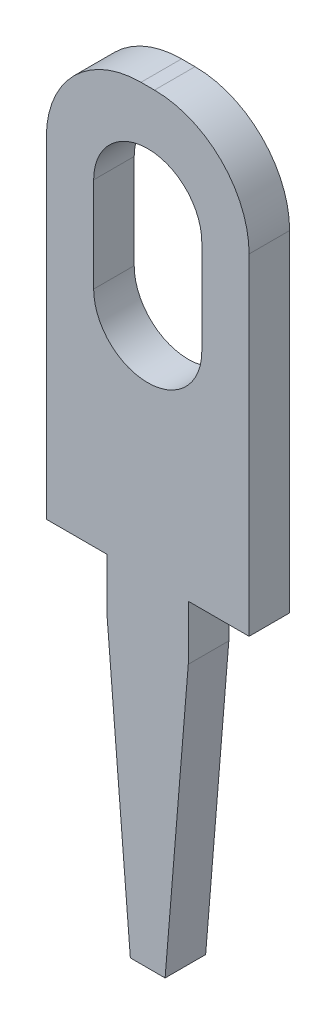
ISO-10303-21;
HEADER;
FILE_DESCRIPTION(('STEP AP214'),'2;1');
FILE_NAME('part.step','',(''),(''),'','','');
FILE_SCHEMA(('AUTOMOTIVE_DESIGN { 1 0 10303 214 1 1 1 1 }'));
ENDSEC;
DATA;
#1=APPLICATION_CONTEXT('core data for automotive mechanical design processes');
#2=APPLICATION_PROTOCOL_DEFINITION('international standard','automotive_design',2000,#1);
#3=PRODUCT_CONTEXT('',#1,'mechanical');
#4=PRODUCT('Part','Part','',(#3));
#5=PRODUCT_RELATED_PRODUCT_CATEGORY('part','',(#4));
#6=PRODUCT_DEFINITION_FORMATION('','',#4);
#7=PRODUCT_DEFINITION_CONTEXT('part definition',#1,'design');
#8=PRODUCT_DEFINITION('design','',#6,#7);
#9=PRODUCT_DEFINITION_SHAPE('','',#8);
#10=(LENGTH_UNIT() NAMED_UNIT(*) SI_UNIT(.MILLI.,.METRE.));
#11=(NAMED_UNIT(*) PLANE_ANGLE_UNIT() SI_UNIT($,.RADIAN.));
#12=(NAMED_UNIT(*) SI_UNIT($,.STERADIAN.) SOLID_ANGLE_UNIT());
#13=UNCERTAINTY_MEASURE_WITH_UNIT(LENGTH_MEASURE(1.E-05),#10,'distance_accuracy_value','');
#14=(GEOMETRIC_REPRESENTATION_CONTEXT(3) GLOBAL_UNCERTAINTY_ASSIGNED_CONTEXT((#13)) GLOBAL_UNIT_ASSIGNED_CONTEXT((#10,
#11,#12)) REPRESENTATION_CONTEXT('',''));
#15=CARTESIAN_POINT('',(0.,0.,0.));
#16=DIRECTION('',(0.,0.,1.));
#17=DIRECTION('',(1.,0.,0.));
#18=AXIS2_PLACEMENT_3D('',#15,#16,#17);
#19=CARTESIAN_POINT('',(-0.0999999999999998,4.9,0.6));
#20=DIRECTION('',(0.,0.,-1.));
#21=DIRECTION('',(-1.,0.,0.));
#22=AXIS2_PLACEMENT_3D('',#19,#20,#21);
#23=PLANE('',#22);
#24=DIRECTION('',(0.,-1.,0.));
#25=VECTOR('',#24,1.);
#26=CARTESIAN_POINT('',(-1.5,0.,0.6));
#27=LINE('',#26,#25);
#28=CARTESIAN_POINT('',(-1.5,4.89999999999999,0.6));
#29=VERTEX_POINT('',#28);
#30=CARTESIAN_POINT('',(-1.5,0.,0.6));
#31=VERTEX_POINT('',#30);
#32=EDGE_CURVE('E180',#29,#31,#27,.T.);
#33=ORIENTED_EDGE('',*,*,#32,.T.);
#34=DIRECTION('',(1.,0.,0.));
#35=VECTOR('',#34,1.);
#36=CARTESIAN_POINT('',(-1.5,0.,0.6));
#37=LINE('',#36,#35);
#38=CARTESIAN_POINT('',(-0.6,0.,0.6));
#39=VERTEX_POINT('',#38);
#40=EDGE_CURVE('E183',#31,#39,#37,.T.);
#41=ORIENTED_EDGE('',*,*,#40,.T.);
#42=DIRECTION('',(0.,-1.,0.));
#43=VECTOR('',#42,1.);
#44=CARTESIAN_POINT('',(-0.6,0.,0.6));
#45=LINE('',#44,#43);
#46=CARTESIAN_POINT('',(-0.6,-0.808174013006271,0.6));
#47=VERTEX_POINT('',#46);
#48=EDGE_CURVE('E186',#39,#47,#45,.T.);
#49=ORIENTED_EDGE('',*,*,#48,.T.);
#50=DIRECTION('',(0.0815209190456559,-0.996671630858404,0.));
#51=VECTOR('',#50,1.);
#52=CARTESIAN_POINT('',(-0.257137319495211,-5.,0.6));
#53=LINE('',#52,#51);
#54=CARTESIAN_POINT('',(-0.257137319495211,-5.,0.6));
#55=VERTEX_POINT('',#54);
#56=EDGE_CURVE('E188',#47,#55,#53,.T.);
#57=ORIENTED_EDGE('',*,*,#56,.T.);
#58=DIRECTION('',(1.,0.,0.));
#59=VECTOR('',#58,1.);
#60=CARTESIAN_POINT('',(-0.257137319495211,-5.,0.6));
#61=LINE('',#60,#59);
#62=CARTESIAN_POINT('',(0.257137319495211,-5.,0.6));
#63=VERTEX_POINT('',#62);
#64=EDGE_CURVE('E190',#55,#63,#61,.T.);
#65=ORIENTED_EDGE('',*,*,#64,.T.);
#66=DIRECTION('',(0.0815209190456559,0.996671630858404,0.));
#67=VECTOR('',#66,1.);
#68=CARTESIAN_POINT('',(0.257137319495211,-5.,0.6));
#69=LINE('',#68,#67);
#70=CARTESIAN_POINT('',(0.6,-0.808174013006271,0.6));
#71=VERTEX_POINT('',#70);
#72=EDGE_CURVE('E192',#63,#71,#69,.T.);
#73=ORIENTED_EDGE('',*,*,#72,.T.);
#74=DIRECTION('',(0.,1.,0.));
#75=VECTOR('',#74,1.);
#76=CARTESIAN_POINT('',(0.6,0.,0.6));
#77=LINE('',#76,#75);
#78=CARTESIAN_POINT('',(0.6,0.,0.6));
#79=VERTEX_POINT('',#78);
#80=EDGE_CURVE('E194',#71,#79,#77,.T.);
#81=ORIENTED_EDGE('',*,*,#80,.T.);
#82=DIRECTION('',(1.,0.,0.));
#83=VECTOR('',#82,1.);
#84=CARTESIAN_POINT('',(0.6,0.,0.6));
#85=LINE('',#84,#83);
#86=CARTESIAN_POINT('',(1.5,0.,0.6));
#87=VERTEX_POINT('',#86);
#88=EDGE_CURVE('E196',#79,#87,#85,.T.);
#89=ORIENTED_EDGE('',*,*,#88,.T.);
#90=DIRECTION('',(0.,1.,0.));
#91=VECTOR('',#90,1.);
#92=CARTESIAN_POINT('',(1.5,0.,0.6));
#93=LINE('',#92,#91);
#94=CARTESIAN_POINT('',(1.5,4.89999999999999,0.6));
#95=VERTEX_POINT('',#94);
#96=EDGE_CURVE('E198',#87,#95,#93,.T.);
#97=ORIENTED_EDGE('',*,*,#96,.T.);
#98=CARTESIAN_POINT('',(0.0999999999999998,4.9,0.6));
#99=DIRECTION('',(0.,0.,1.));
#100=DIRECTION('',(-1.,0.,0.));
#101=AXIS2_PLACEMENT_3D('',#98,#99,#100);
#102=CIRCLE('',#101,1.4);
#103=CARTESIAN_POINT('',(0.0999999999999904,6.3,0.6));
#104=VERTEX_POINT('',#103);
#105=EDGE_CURVE('E200',#95,#104,#102,.T.);
#106=ORIENTED_EDGE('',*,*,#105,.T.);
#107=DIRECTION('',(-1.,0.,0.));
#108=VECTOR('',#107,1.);
#109=CARTESIAN_POINT('',(-0.0999999999999903,6.3,0.6));
#110=LINE('',#109,#108);
#111=CARTESIAN_POINT('',(-0.0999999999999903,6.3,0.6));
#112=VERTEX_POINT('',#111);
#113=EDGE_CURVE('E202',#104,#112,#110,.T.);
#114=ORIENTED_EDGE('',*,*,#113,.T.);
#115=CARTESIAN_POINT('',(-0.0999999999999998,4.9,0.6));
#116=DIRECTION('',(0.,0.,1.));
#117=DIRECTION('',(-1.,0.,0.));
#118=AXIS2_PLACEMENT_3D('',#115,#116,#117);
#119=CIRCLE('',#118,1.4);
#120=EDGE_CURVE('E204',#112,#29,#119,.T.);
#121=ORIENTED_EDGE('',*,*,#120,.T.);
#122=EDGE_LOOP('',(#33,#41,#49,#57,#65,#73,#81,#89,#97,#106,#114,#121));
#123=FACE_BOUND('',#122,.T.);
#124=CARTESIAN_POINT('',(0.,4.7,0.6));
#125=DIRECTION('',(0.,0.,1.));
#126=DIRECTION('',(1.,0.,0.));
#127=AXIS2_PLACEMENT_3D('',#124,#125,#126);
#128=CIRCLE('',#127,0.8);
#129=CARTESIAN_POINT('',(0.8,4.7,0.6));
#130=VERTEX_POINT('',#129);
#131=CARTESIAN_POINT('',(-0.8,4.7,0.6));
#132=VERTEX_POINT('',#131);
#133=EDGE_CURVE('E144',#130,#132,#128,.T.);
#134=ORIENTED_EDGE('',*,*,#133,.F.);
#135=DIRECTION('',(0.,1.,0.));
#136=VECTOR('',#135,1.);
#137=CARTESIAN_POINT('',(0.8,4.7,0.6));
#138=LINE('',#137,#136);
#139=CARTESIAN_POINT('',(0.8,3.3,0.6));
#140=VERTEX_POINT('',#139);
#141=EDGE_CURVE('E166',#140,#130,#138,.T.);
#142=ORIENTED_EDGE('',*,*,#141,.F.);
#143=CARTESIAN_POINT('',(0.,3.3,0.6));
#144=DIRECTION('',(0.,0.,1.));
#145=DIRECTION('',(1.,0.,0.));
#146=AXIS2_PLACEMENT_3D('',#143,#144,#145);
#147=CIRCLE('',#146,0.8);
#148=CARTESIAN_POINT('',(-0.8,3.3,0.6));
#149=VERTEX_POINT('',#148);
#150=EDGE_CURVE('E164',#149,#140,#147,.T.);
#151=ORIENTED_EDGE('',*,*,#150,.F.);
#152=DIRECTION('',(0.,-1.,0.));
#153=VECTOR('',#152,1.);
#154=CARTESIAN_POINT('',(-0.8,4.7,0.6));
#155=LINE('',#154,#153);
#156=EDGE_CURVE('E152',#132,#149,#155,.T.);
#157=ORIENTED_EDGE('',*,*,#156,.F.);
#158=EDGE_LOOP('',(#134,#142,#151,#157));
#159=FACE_BOUND('',#158,.T.);
#160=ADVANCED_FACE('F31',(#123,#159),#23,.F.);
#161=CARTESIAN_POINT('',(-0.0999999999999998,4.9,0.));
#162=DIRECTION('',(0.,0.,-1.));
#163=DIRECTION('',(-1.,0.,0.));
#164=AXIS2_PLACEMENT_3D('',#161,#162,#163);
#165=PLANE('',#164);
#166=DIRECTION('',(0.,-1.,0.));
#167=VECTOR('',#166,1.);
#168=CARTESIAN_POINT('',(-1.5,0.,0.));
#169=LINE('',#168,#167);
#170=CARTESIAN_POINT('',(-1.5,4.89999999999999,0.));
#171=VERTEX_POINT('',#170);
#172=CARTESIAN_POINT('',(-1.5,0.,0.));
#173=VERTEX_POINT('',#172);
#174=EDGE_CURVE('E160',#171,#173,#169,.T.);
#175=ORIENTED_EDGE('',*,*,#174,.F.);
#176=CARTESIAN_POINT('',(-0.0999999999999998,4.9,0.));
#177=DIRECTION('',(0.,0.,1.));
#178=DIRECTION('',(-1.,0.,0.));
#179=AXIS2_PLACEMENT_3D('',#176,#177,#178);
#180=CIRCLE('',#179,1.4);
#181=CARTESIAN_POINT('',(-0.0999999999999903,6.3,0.));
#182=VERTEX_POINT('',#181);
#183=EDGE_CURVE('E184',#182,#171,#180,.T.);
#184=ORIENTED_EDGE('',*,*,#183,.F.);
#185=DIRECTION('',(-1.,0.,0.));
#186=VECTOR('',#185,1.);
#187=CARTESIAN_POINT('',(-0.0999999999999903,6.3,0.));
#188=LINE('',#187,#186);
#189=CARTESIAN_POINT('',(0.0999999999999904,6.3,0.));
#190=VERTEX_POINT('',#189);
#191=EDGE_CURVE('E227',#190,#182,#188,.T.);
#192=ORIENTED_EDGE('',*,*,#191,.F.);
#193=CARTESIAN_POINT('',(0.0999999999999998,4.9,0.));
#194=DIRECTION('',(0.,0.,1.));
#195=DIRECTION('',(-1.,0.,0.));
#196=AXIS2_PLACEMENT_3D('',#193,#194,#195);
#197=CIRCLE('',#196,1.4);
#198=CARTESIAN_POINT('',(1.5,4.89999999999999,0.));
#199=VERTEX_POINT('',#198);
#200=EDGE_CURVE('E225',#199,#190,#197,.T.);
#201=ORIENTED_EDGE('',*,*,#200,.F.);
#202=DIRECTION('',(0.,1.,0.));
#203=VECTOR('',#202,1.);
#204=CARTESIAN_POINT('',(1.5,0.,0.));
#205=LINE('',#204,#203);
#206=CARTESIAN_POINT('',(1.5,0.,0.));
#207=VERTEX_POINT('',#206);
#208=EDGE_CURVE('E223',#207,#199,#205,.T.);
#209=ORIENTED_EDGE('',*,*,#208,.F.);
#210=DIRECTION('',(1.,0.,0.));
#211=VECTOR('',#210,1.);
#212=CARTESIAN_POINT('',(0.6,0.,0.));
#213=LINE('',#212,#211);
#214=CARTESIAN_POINT('',(0.6,0.,0.));
#215=VERTEX_POINT('',#214);
#216=EDGE_CURVE('E221',#215,#207,#213,.T.);
#217=ORIENTED_EDGE('',*,*,#216,.F.);
#218=DIRECTION('',(0.,1.,0.));
#219=VECTOR('',#218,1.);
#220=CARTESIAN_POINT('',(0.6,0.,0.));
#221=LINE('',#220,#219);
#222=CARTESIAN_POINT('',(0.6,-0.808174013006271,0.));
#223=VERTEX_POINT('',#222);
#224=EDGE_CURVE('E219',#223,#215,#221,.T.);
#225=ORIENTED_EDGE('',*,*,#224,.F.);
#226=DIRECTION('',(0.0815209190456559,0.996671630858404,0.));
#227=VECTOR('',#226,1.);
#228=CARTESIAN_POINT('',(0.257137319495211,-5.,0.));
#229=LINE('',#228,#227);
#230=CARTESIAN_POINT('',(0.257137319495211,-5.,0.));
#231=VERTEX_POINT('',#230);
#232=EDGE_CURVE('E217',#231,#223,#229,.T.);
#233=ORIENTED_EDGE('',*,*,#232,.F.);
#234=DIRECTION('',(1.,0.,0.));
#235=VECTOR('',#234,1.);
#236=CARTESIAN_POINT('',(-0.257137319495211,-5.,0.));
#237=LINE('',#236,#235);
#238=CARTESIAN_POINT('',(-0.257137319495211,-5.,0.));
#239=VERTEX_POINT('',#238);
#240=EDGE_CURVE('E215',#239,#231,#237,.T.);
#241=ORIENTED_EDGE('',*,*,#240,.F.);
#242=DIRECTION('',(0.0815209190456559,-0.996671630858404,0.));
#243=VECTOR('',#242,1.);
#244=CARTESIAN_POINT('',(-0.257137319495211,-5.,0.));
#245=LINE('',#244,#243);
#246=CARTESIAN_POINT('',(-0.6,-0.808174013006271,0.));
#247=VERTEX_POINT('',#246);
#248=EDGE_CURVE('E213',#247,#239,#245,.T.);
#249=ORIENTED_EDGE('',*,*,#248,.F.);
#250=DIRECTION('',(0.,-1.,0.));
#251=VECTOR('',#250,1.);
#252=CARTESIAN_POINT('',(-0.6,0.,0.));
#253=LINE('',#252,#251);
#254=CARTESIAN_POINT('',(-0.6,0.,0.));
#255=VERTEX_POINT('',#254);
#256=EDGE_CURVE('E211',#255,#247,#253,.T.);
#257=ORIENTED_EDGE('',*,*,#256,.F.);
#258=DIRECTION('',(1.,0.,0.));
#259=VECTOR('',#258,1.);
#260=CARTESIAN_POINT('',(-1.5,0.,0.));
#261=LINE('',#260,#259);
#262=EDGE_CURVE('E209',#173,#255,#261,.T.);
#263=ORIENTED_EDGE('',*,*,#262,.F.);
#264=EDGE_LOOP('',(#175,#184,#192,#201,#209,#217,#225,#233,#241,#249,#257,#263));
#265=FACE_BOUND('',#264,.T.);
#266=DIRECTION('',(0.,1.,0.));
#267=VECTOR('',#266,1.);
#268=CARTESIAN_POINT('',(0.8,4.7,0.));
#269=LINE('',#268,#267);
#270=CARTESIAN_POINT('',(0.8,3.3,0.));
#271=VERTEX_POINT('',#270);
#272=CARTESIAN_POINT('',(0.8,4.7,0.));
#273=VERTEX_POINT('',#272);
#274=EDGE_CURVE('E153',#271,#273,#269,.T.);
#275=ORIENTED_EDGE('',*,*,#274,.T.);
#276=CARTESIAN_POINT('',(0.,4.7,0.));
#277=DIRECTION('',(0.,0.,1.));
#278=DIRECTION('',(1.,0.,0.));
#279=AXIS2_PLACEMENT_3D('',#276,#277,#278);
#280=CIRCLE('',#279,0.8);
#281=CARTESIAN_POINT('',(-0.8,4.7,0.));
#282=VERTEX_POINT('',#281);
#283=EDGE_CURVE('E54',#273,#282,#280,.T.);
#284=ORIENTED_EDGE('',*,*,#283,.T.);
#285=DIRECTION('',(0.,-1.,0.));
#286=VECTOR('',#285,1.);
#287=CARTESIAN_POINT('',(-0.8,4.7,0.));
#288=LINE('',#287,#286);
#289=CARTESIAN_POINT('',(-0.8,3.3,0.));
#290=VERTEX_POINT('',#289);
#291=EDGE_CURVE('E159',#282,#290,#288,.T.);
#292=ORIENTED_EDGE('',*,*,#291,.T.);
#293=CARTESIAN_POINT('',(0.,3.3,0.));
#294=DIRECTION('',(0.,0.,1.));
#295=DIRECTION('',(1.,0.,0.));
#296=AXIS2_PLACEMENT_3D('',#293,#294,#295);
#297=CIRCLE('',#296,0.8);
#298=EDGE_CURVE('E172',#290,#271,#297,.T.);
#299=ORIENTED_EDGE('',*,*,#298,.T.);
#300=EDGE_LOOP('',(#275,#284,#292,#299));
#301=FACE_BOUND('',#300,.T.);
#302=ADVANCED_FACE('F269',(#265,#301),#165,.T.);
#303=CARTESIAN_POINT('',(-1.5,0.,0.6));
#304=DIRECTION('',(1.,0.,0.));
#305=DIRECTION('',(0.,0.,-1.));
#306=AXIS2_PLACEMENT_3D('',#303,#304,#305);
#307=PLANE('',#306);
#308=ORIENTED_EDGE('',*,*,#174,.T.);
#309=DIRECTION('',(0.,0.,-1.));
#310=VECTOR('',#309,1.);
#311=CARTESIAN_POINT('',(-1.5,0.,0.6));
#312=LINE('',#311,#310);
#313=EDGE_CURVE('E11',#31,#173,#312,.T.);
#314=ORIENTED_EDGE('',*,*,#313,.F.);
#315=ORIENTED_EDGE('',*,*,#32,.F.);
#316=DIRECTION('',(0.,0.,-1.));
#317=VECTOR('',#316,1.);
#318=CARTESIAN_POINT('',(-1.5,4.89999999999999,0.6));
#319=LINE('',#318,#317);
#320=EDGE_CURVE('E206',#29,#171,#319,.T.);
#321=ORIENTED_EDGE('',*,*,#320,.T.);
#322=EDGE_LOOP('',(#308,#314,#315,#321));
#323=FACE_BOUND('',#322,.T.);
#324=ADVANCED_FACE('F33',(#323),#307,.F.);
#325=CARTESIAN_POINT('',(-1.5,0.,0.6));
#326=DIRECTION('',(0.,1.,0.));
#327=DIRECTION('',(-1.,0.,0.));
#328=AXIS2_PLACEMENT_3D('',#325,#326,#327);
#329=PLANE('',#328);
#330=ORIENTED_EDGE('',*,*,#262,.T.);
#331=DIRECTION('',(0.,0.,-1.));
#332=VECTOR('',#331,1.);
#333=CARTESIAN_POINT('',(-0.6,0.,0.6));
#334=LINE('',#333,#332);
#335=EDGE_CURVE('E39',#39,#255,#334,.T.);
#336=ORIENTED_EDGE('',*,*,#335,.F.);
#337=ORIENTED_EDGE('',*,*,#40,.F.);
#338=ORIENTED_EDGE('',*,*,#313,.T.);
#339=EDGE_LOOP('',(#330,#336,#337,#338));
#340=FACE_BOUND('',#339,.T.);
#341=ADVANCED_FACE('F286',(#340),#329,.F.);
#342=CARTESIAN_POINT('',(-0.6,0.,0.6));
#343=DIRECTION('',(1.,0.,0.));
#344=DIRECTION('',(0.,1.,0.));
#345=AXIS2_PLACEMENT_3D('',#342,#343,#344);
#346=PLANE('',#345);
#347=ORIENTED_EDGE('',*,*,#256,.T.);
#348=DIRECTION('',(0.,0.,-1.));
#349=VECTOR('',#348,1.);
#350=CARTESIAN_POINT('',(-0.6,-0.808174013006271,0.6));
#351=LINE('',#350,#349);
#352=EDGE_CURVE('E256',#47,#247,#351,.T.);
#353=ORIENTED_EDGE('',*,*,#352,.F.);
#354=ORIENTED_EDGE('',*,*,#48,.F.);
#355=ORIENTED_EDGE('',*,*,#335,.T.);
#356=EDGE_LOOP('',(#347,#353,#354,#355));
#357=FACE_BOUND('',#356,.T.);
#358=ADVANCED_FACE('F263',(#357),#346,.F.);
#359=CARTESIAN_POINT('',(-0.257137319495211,-5.,0.6));
#360=DIRECTION('',(0.996671630858404,0.0815209190456558,0.));
#361=DIRECTION('',(-0.0815209190456559,0.996671630858405,0.));
#362=AXIS2_PLACEMENT_3D('',#359,#360,#361);
#363=PLANE('',#362);
#364=ORIENTED_EDGE('',*,*,#248,.T.);
#365=DIRECTION('',(0.,0.,-1.));
#366=VECTOR('',#365,1.);
#367=CARTESIAN_POINT('',(-0.257137319495211,-5.,0.6));
#368=LINE('',#367,#366);
#369=EDGE_CURVE('E253',#55,#239,#368,.T.);
#370=ORIENTED_EDGE('',*,*,#369,.F.);
#371=ORIENTED_EDGE('',*,*,#56,.F.);
#372=ORIENTED_EDGE('',*,*,#352,.T.);
#373=EDGE_LOOP('',(#364,#370,#371,#372));
#374=FACE_BOUND('',#373,.T.);
#375=ADVANCED_FACE('F275',(#374),#363,.F.);
#376=CARTESIAN_POINT('',(-0.257137319495211,-5.,0.6));
#377=DIRECTION('',(0.,1.,0.));
#378=DIRECTION('',(0.,0.,1.));
#379=AXIS2_PLACEMENT_3D('',#376,#377,#378);
#380=PLANE('',#379);
#381=ORIENTED_EDGE('',*,*,#240,.T.);
#382=DIRECTION('',(0.,0.,-1.));
#383=VECTOR('',#382,1.);
#384=CARTESIAN_POINT('',(0.257137319495211,-5.,0.6));
#385=LINE('',#384,#383);
#386=EDGE_CURVE('E250',#63,#231,#385,.T.);
#387=ORIENTED_EDGE('',*,*,#386,.F.);
#388=ORIENTED_EDGE('',*,*,#64,.F.);
#389=ORIENTED_EDGE('',*,*,#369,.T.);
#390=EDGE_LOOP('',(#381,#387,#388,#389));
#391=FACE_BOUND('',#390,.T.);
#392=ADVANCED_FACE('F279',(#391),#380,.F.);
#393=CARTESIAN_POINT('',(0.257137319495211,-5.,0.6));
#394=DIRECTION('',(-0.996671630858404,0.0815209190456558,0.));
#395=DIRECTION('',(-0.0815209190456559,-0.996671630858405,0.));
#396=AXIS2_PLACEMENT_3D('',#393,#394,#395);
#397=PLANE('',#396);
#398=ORIENTED_EDGE('',*,*,#232,.T.);
#399=DIRECTION('',(0.,0.,-1.));
#400=VECTOR('',#399,1.);
#401=CARTESIAN_POINT('',(0.6,-0.808174013006271,0.6));
#402=LINE('',#401,#400);
#403=EDGE_CURVE('E247',#71,#223,#402,.T.);
#404=ORIENTED_EDGE('',*,*,#403,.F.);
#405=ORIENTED_EDGE('',*,*,#72,.F.);
#406=ORIENTED_EDGE('',*,*,#386,.T.);
#407=EDGE_LOOP('',(#398,#404,#405,#406));
#408=FACE_BOUND('',#407,.T.);
#409=ADVANCED_FACE('F319',(#408),#397,.F.);
#410=CARTESIAN_POINT('',(0.6,0.,0.6));
#411=DIRECTION('',(-1.,0.,0.));
#412=DIRECTION('',(0.,-1.,0.));
#413=AXIS2_PLACEMENT_3D('',#410,#411,#412);
#414=PLANE('',#413);
#415=ORIENTED_EDGE('',*,*,#224,.T.);
#416=DIRECTION('',(0.,0.,-1.));
#417=VECTOR('',#416,1.);
#418=CARTESIAN_POINT('',(0.6,0.,0.6));
#419=LINE('',#418,#417);
#420=EDGE_CURVE('E244',#79,#215,#419,.T.);
#421=ORIENTED_EDGE('',*,*,#420,.F.);
#422=ORIENTED_EDGE('',*,*,#80,.F.);
#423=ORIENTED_EDGE('',*,*,#403,.T.);
#424=EDGE_LOOP('',(#415,#421,#422,#423));
#425=FACE_BOUND('',#424,.T.);
#426=ADVANCED_FACE('F317',(#425),#414,.F.);
#427=CARTESIAN_POINT('',(0.6,0.,0.6));
#428=DIRECTION('',(0.,1.,0.));
#429=DIRECTION('',(-1.,0.,0.));
#430=AXIS2_PLACEMENT_3D('',#427,#428,#429);
#431=PLANE('',#430);
#432=ORIENTED_EDGE('',*,*,#216,.T.);
#433=DIRECTION('',(0.,0.,-1.));
#434=VECTOR('',#433,1.);
#435=CARTESIAN_POINT('',(1.5,0.,0.6));
#436=LINE('',#435,#434);
#437=EDGE_CURVE('E241',#87,#207,#436,.T.);
#438=ORIENTED_EDGE('',*,*,#437,.F.);
#439=ORIENTED_EDGE('',*,*,#88,.F.);
#440=ORIENTED_EDGE('',*,*,#420,.T.);
#441=EDGE_LOOP('',(#432,#438,#439,#440));
#442=FACE_BOUND('',#441,.T.);
#443=ADVANCED_FACE('F313',(#442),#431,.F.);
#444=CARTESIAN_POINT('',(1.5,0.,0.6));
#445=DIRECTION('',(-1.,0.,0.));
#446=DIRECTION('',(0.,0.,1.));
#447=AXIS2_PLACEMENT_3D('',#444,#445,#446);
#448=PLANE('',#447);
#449=ORIENTED_EDGE('',*,*,#208,.T.);
#450=DIRECTION('',(0.,0.,-1.));
#451=VECTOR('',#450,1.);
#452=CARTESIAN_POINT('',(1.5,4.89999999999999,0.6));
#453=LINE('',#452,#451);
#454=EDGE_CURVE('E238',#95,#199,#453,.T.);
#455=ORIENTED_EDGE('',*,*,#454,.F.);
#456=ORIENTED_EDGE('',*,*,#96,.F.);
#457=ORIENTED_EDGE('',*,*,#437,.T.);
#458=EDGE_LOOP('',(#449,#455,#456,#457));
#459=FACE_BOUND('',#458,.T.);
#460=ADVANCED_FACE('F308',(#459),#448,.F.);
#461=CARTESIAN_POINT('',(0.0999999999999998,4.9,0.6));
#462=DIRECTION('',(0.,0.,-1.));
#463=DIRECTION('',(-1.,0.,0.));
#464=AXIS2_PLACEMENT_3D('',#461,#462,#463);
#465=CYLINDRICAL_SURFACE('',#464,1.4);
#466=ORIENTED_EDGE('',*,*,#200,.T.);
#467=DIRECTION('',(0.,0.,-1.));
#468=VECTOR('',#467,1.);
#469=CARTESIAN_POINT('',(0.0999999999999904,6.3,0.6));
#470=LINE('',#469,#468);
#471=EDGE_CURVE('E235',#104,#190,#470,.T.);
#472=ORIENTED_EDGE('',*,*,#471,.F.);
#473=ORIENTED_EDGE('',*,*,#105,.F.);
#474=ORIENTED_EDGE('',*,*,#454,.T.);
#475=EDGE_LOOP('',(#466,#472,#473,#474));
#476=FACE_BOUND('',#475,.T.);
#477=ADVANCED_FACE('F302',(#476),#465,.T.);
#478=CARTESIAN_POINT('',(-0.0999999999999903,6.3,0.6));
#479=DIRECTION('',(0.,-1.,0.));
#480=DIRECTION('',(0.,0.,-1.));
#481=AXIS2_PLACEMENT_3D('',#478,#479,#480);
#482=PLANE('',#481);
#483=ORIENTED_EDGE('',*,*,#191,.T.);
#484=DIRECTION('',(0.,0.,-1.));
#485=VECTOR('',#484,1.);
#486=CARTESIAN_POINT('',(-0.0999999999999903,6.3,0.6));
#487=LINE('',#486,#485);
#488=EDGE_CURVE('E232',#112,#182,#487,.T.);
#489=ORIENTED_EDGE('',*,*,#488,.F.);
#490=ORIENTED_EDGE('',*,*,#113,.F.);
#491=ORIENTED_EDGE('',*,*,#471,.T.);
#492=EDGE_LOOP('',(#483,#489,#490,#491));
#493=FACE_BOUND('',#492,.T.);
#494=ADVANCED_FACE('F298',(#493),#482,.F.);
#495=CARTESIAN_POINT('',(-0.0999999999999998,4.9,0.6));
#496=DIRECTION('',(0.,0.,-1.));
#497=DIRECTION('',(-1.,0.,0.));
#498=AXIS2_PLACEMENT_3D('',#495,#496,#497);
#499=CYLINDRICAL_SURFACE('',#498,1.4);
#500=ORIENTED_EDGE('',*,*,#183,.T.);
#501=ORIENTED_EDGE('',*,*,#320,.F.);
#502=ORIENTED_EDGE('',*,*,#120,.F.);
#503=ORIENTED_EDGE('',*,*,#488,.T.);
#504=EDGE_LOOP('',(#500,#501,#502,#503));
#505=FACE_BOUND('',#504,.T.);
#506=ADVANCED_FACE('F293',(#505),#499,.T.);
#507=CARTESIAN_POINT('',(0.,4.7,0.6));
#508=DIRECTION('',(0.,0.,-1.));
#509=DIRECTION('',(-1.,0.,0.));
#510=AXIS2_PLACEMENT_3D('',#507,#508,#509);
#511=CYLINDRICAL_SURFACE('',#510,0.8);
#512=ORIENTED_EDGE('',*,*,#283,.F.);
#513=DIRECTION('',(0.,0.,-1.));
#514=VECTOR('',#513,1.);
#515=CARTESIAN_POINT('',(0.8,4.7,0.6));
#516=LINE('',#515,#514);
#517=EDGE_CURVE('E148',#130,#273,#516,.T.);
#518=ORIENTED_EDGE('',*,*,#517,.F.);
#519=ORIENTED_EDGE('',*,*,#133,.T.);
#520=DIRECTION('',(0.,0.,-1.));
#521=VECTOR('',#520,1.);
#522=CARTESIAN_POINT('',(-0.8,4.7,0.6));
#523=LINE('',#522,#521);
#524=EDGE_CURVE('E147',#132,#282,#523,.T.);
#525=ORIENTED_EDGE('',*,*,#524,.T.);
#526=EDGE_LOOP('',(#512,#518,#519,#525));
#527=FACE_BOUND('',#526,.T.);
#528=ADVANCED_FACE('F146',(#527),#511,.F.);
#529=CARTESIAN_POINT('',(-0.8,4.7,0.6));
#530=DIRECTION('',(1.,0.,0.));
#531=DIRECTION('',(0.,1.,0.));
#532=AXIS2_PLACEMENT_3D('',#529,#530,#531);
#533=PLANE('',#532);
#534=ORIENTED_EDGE('',*,*,#291,.F.);
#535=ORIENTED_EDGE('',*,*,#524,.F.);
#536=ORIENTED_EDGE('',*,*,#156,.T.);
#537=DIRECTION('',(0.,0.,-1.));
#538=VECTOR('',#537,1.);
#539=CARTESIAN_POINT('',(-0.8,3.3,0.6));
#540=LINE('',#539,#538);
#541=EDGE_CURVE('E161',#149,#290,#540,.T.);
#542=ORIENTED_EDGE('',*,*,#541,.T.);
#543=EDGE_LOOP('',(#534,#535,#536,#542));
#544=FACE_BOUND('',#543,.T.);
#545=ADVANCED_FACE('F156',(#544),#533,.T.);
#546=CARTESIAN_POINT('',(0.,3.3,0.6));
#547=DIRECTION('',(0.,0.,-1.));
#548=DIRECTION('',(-1.,0.,0.));
#549=AXIS2_PLACEMENT_3D('',#546,#547,#548);
#550=CYLINDRICAL_SURFACE('',#549,0.8);
#551=ORIENTED_EDGE('',*,*,#298,.F.);
#552=ORIENTED_EDGE('',*,*,#541,.F.);
#553=ORIENTED_EDGE('',*,*,#150,.T.);
#554=DIRECTION('',(0.,0.,-1.));
#555=VECTOR('',#554,1.);
#556=CARTESIAN_POINT('',(0.8,3.3,0.6));
#557=LINE('',#556,#555);
#558=EDGE_CURVE('E46',#140,#271,#557,.T.);
#559=ORIENTED_EDGE('',*,*,#558,.T.);
#560=EDGE_LOOP('',(#551,#552,#553,#559));
#561=FACE_BOUND('',#560,.T.);
#562=ADVANCED_FACE('F377',(#561),#550,.F.);
#563=CARTESIAN_POINT('',(0.8,4.7,0.6));
#564=DIRECTION('',(-1.,0.,0.));
#565=DIRECTION('',(0.,-1.,0.));
#566=AXIS2_PLACEMENT_3D('',#563,#564,#565);
#567=PLANE('',#566);
#568=ORIENTED_EDGE('',*,*,#274,.F.);
#569=ORIENTED_EDGE('',*,*,#558,.F.);
#570=ORIENTED_EDGE('',*,*,#141,.T.);
#571=ORIENTED_EDGE('',*,*,#517,.T.);
#572=EDGE_LOOP('',(#568,#569,#570,#571));
#573=FACE_BOUND('',#572,.T.);
#574=ADVANCED_FACE('F383',(#573),#567,.T.);
#575=CLOSED_SHELL('',(#160,#302,#324,#341,#358,#375,#392,#409,#426,#443,#460,#477,#494,#506,
#528,#545,#562,#574));
#576=MANIFOLD_SOLID_BREP('B2',#575);
#577=ADVANCED_BREP_SHAPE_REPRESENTATION('',(#18,#576),#14);
#578=SHAPE_DEFINITION_REPRESENTATION(#9,#577);
ENDSEC;
END-ISO-10303-21;
